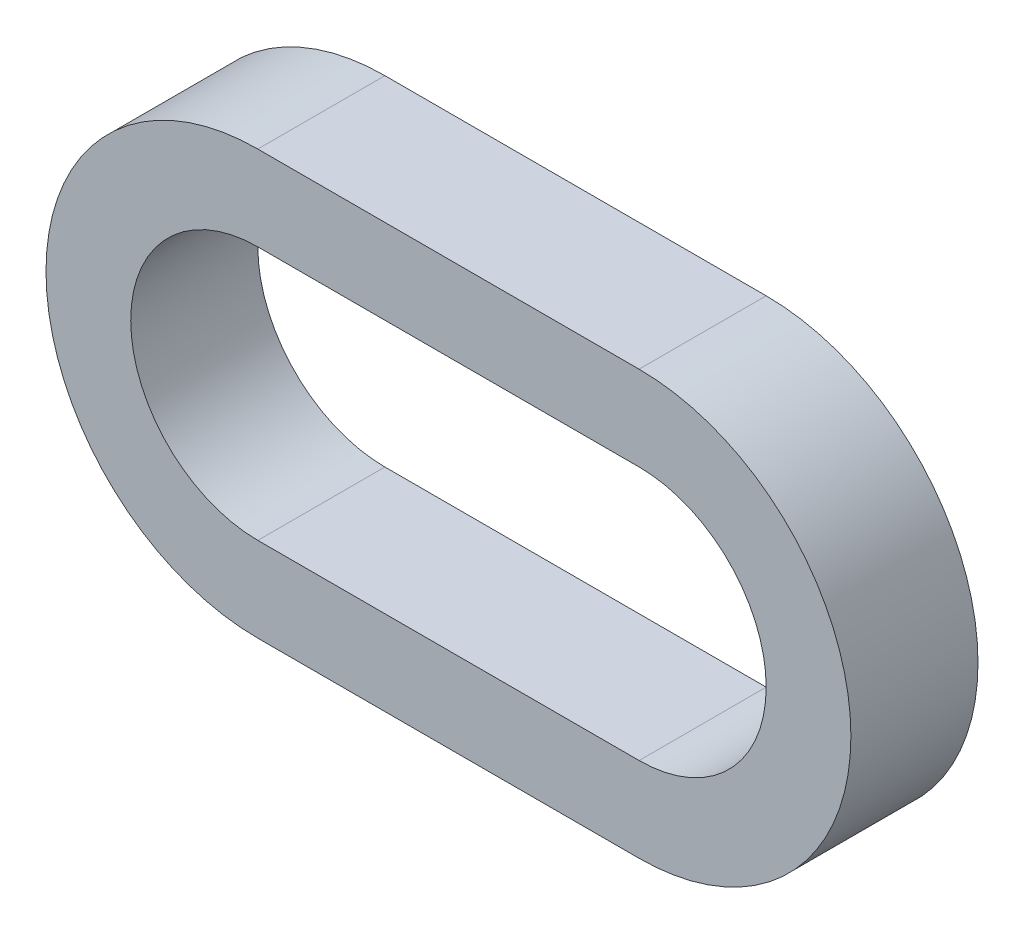
ISO-10303-21;
HEADER;
FILE_DESCRIPTION(('STEP AP214'),'2;1');
FILE_NAME('part.step','',(''),(''),'','','');
FILE_SCHEMA(('AUTOMOTIVE_DESIGN { 1 0 10303 214 1 1 1 1 }'));
ENDSEC;
DATA;
#1=APPLICATION_CONTEXT('core data for automotive mechanical design processes');
#2=APPLICATION_PROTOCOL_DEFINITION('international standard','automotive_design',2000,#1);
#3=PRODUCT_CONTEXT('',#1,'mechanical');
#4=PRODUCT('Part','Part','',(#3));
#5=PRODUCT_RELATED_PRODUCT_CATEGORY('part','',(#4));
#6=PRODUCT_DEFINITION_FORMATION('','',#4);
#7=PRODUCT_DEFINITION_CONTEXT('part definition',#1,'design');
#8=PRODUCT_DEFINITION('design','',#6,#7);
#9=PRODUCT_DEFINITION_SHAPE('','',#8);
#10=(LENGTH_UNIT() NAMED_UNIT(*) SI_UNIT(.MILLI.,.METRE.));
#11=(NAMED_UNIT(*) PLANE_ANGLE_UNIT() SI_UNIT($,.RADIAN.));
#12=(NAMED_UNIT(*) SI_UNIT($,.STERADIAN.) SOLID_ANGLE_UNIT());
#13=UNCERTAINTY_MEASURE_WITH_UNIT(LENGTH_MEASURE(1.E-05),#10,'distance_accuracy_value','');
#14=(GEOMETRIC_REPRESENTATION_CONTEXT(3) GLOBAL_UNCERTAINTY_ASSIGNED_CONTEXT((#13)) GLOBAL_UNIT_ASSIGNED_CONTEXT((#10,
#11,#12)) REPRESENTATION_CONTEXT('',''));
#15=CARTESIAN_POINT('',(0.,0.,0.));
#16=DIRECTION('',(0.,0.,1.));
#17=DIRECTION('',(1.,0.,0.));
#18=AXIS2_PLACEMENT_3D('',#15,#16,#17);
#19=CARTESIAN_POINT('',(-90.,0.,60.));
#20=DIRECTION('',(0.,0.,1.));
#21=DIRECTION('',(1.,0.,0.));
#22=AXIS2_PLACEMENT_3D('',#19,#20,#21);
#23=PLANE('',#22);
#24=CARTESIAN_POINT('',(-90.,0.,60.));
#25=DIRECTION('',(0.,0.,1.));
#26=DIRECTION('',(1.,0.,0.));
#27=AXIS2_PLACEMENT_3D('',#24,#25,#26);
#28=CIRCLE('',#27,100.);
#29=CARTESIAN_POINT('',(-90.,100.,60.));
#30=VERTEX_POINT('',#29);
#31=CARTESIAN_POINT('',(-90.,-100.,60.));
#32=VERTEX_POINT('',#31);
#33=EDGE_CURVE('E157',#30,#32,#28,.T.);
#34=ORIENTED_EDGE('',*,*,#33,.T.);
#35=DIRECTION('',(1.,0.,0.));
#36=VECTOR('',#35,1.);
#37=CARTESIAN_POINT('',(-90.,-100.,60.));
#38=LINE('',#37,#36);
#39=CARTESIAN_POINT('',(90.,-100.,60.));
#40=VERTEX_POINT('',#39);
#41=EDGE_CURVE('E161',#32,#40,#38,.T.);
#42=ORIENTED_EDGE('',*,*,#41,.T.);
#43=CARTESIAN_POINT('',(90.,0.,60.));
#44=DIRECTION('',(0.,0.,1.));
#45=DIRECTION('',(1.,0.,0.));
#46=AXIS2_PLACEMENT_3D('',#43,#44,#45);
#47=CIRCLE('',#46,100.);
#48=CARTESIAN_POINT('',(90.,100.,60.));
#49=VERTEX_POINT('',#48);
#50=EDGE_CURVE('E165',#40,#49,#47,.T.);
#51=ORIENTED_EDGE('',*,*,#50,.T.);
#52=DIRECTION('',(-1.,0.,0.));
#53=VECTOR('',#52,1.);
#54=CARTESIAN_POINT('',(-90.,100.,60.));
#55=LINE('',#54,#53);
#56=EDGE_CURVE('E168',#49,#30,#55,.T.);
#57=ORIENTED_EDGE('',*,*,#56,.T.);
#58=EDGE_LOOP('',(#34,#42,#51,#57));
#59=FACE_BOUND('',#58,.T.);
#60=DIRECTION('',(1.,0.,0.));
#61=VECTOR('',#60,1.);
#62=CARTESIAN_POINT('',(-90.,-60.,60.));
#63=LINE('',#62,#61);
#64=CARTESIAN_POINT('',(-90.,-60.,60.));
#65=VERTEX_POINT('',#64);
#66=CARTESIAN_POINT('',(90.,-60.,60.));
#67=VERTEX_POINT('',#66);
#68=EDGE_CURVE('E118',#65,#67,#63,.T.);
#69=ORIENTED_EDGE('',*,*,#68,.F.);
#70=CARTESIAN_POINT('',(-90.,0.,60.));
#71=DIRECTION('',(0.,0.,1.));
#72=DIRECTION('',(1.,0.,0.));
#73=AXIS2_PLACEMENT_3D('',#70,#71,#72);
#74=CIRCLE('',#73,60.);
#75=CARTESIAN_POINT('',(-90.,60.,60.));
#76=VERTEX_POINT('',#75);
#77=EDGE_CURVE('E109',#76,#65,#74,.T.);
#78=ORIENTED_EDGE('',*,*,#77,.F.);
#79=DIRECTION('',(-1.,0.,0.));
#80=VECTOR('',#79,1.);
#81=CARTESIAN_POINT('',(-90.,60.,60.));
#82=LINE('',#81,#80);
#83=CARTESIAN_POINT('',(90.,60.,60.));
#84=VERTEX_POINT('',#83);
#85=EDGE_CURVE('E135',#84,#76,#82,.T.);
#86=ORIENTED_EDGE('',*,*,#85,.F.);
#87=CARTESIAN_POINT('',(90.,0.,60.));
#88=DIRECTION('',(0.,0.,1.));
#89=DIRECTION('',(1.,0.,0.));
#90=AXIS2_PLACEMENT_3D('',#87,#88,#89);
#91=CIRCLE('',#90,60.);
#92=EDGE_CURVE('E131',#67,#84,#91,.T.);
#93=ORIENTED_EDGE('',*,*,#92,.F.);
#94=EDGE_LOOP('',(#69,#78,#86,#93));
#95=FACE_BOUND('',#94,.T.);
#96=ADVANCED_FACE('F43',(#59,#95),#23,.T.);
#97=CARTESIAN_POINT('',(-90.,0.,0.));
#98=DIRECTION('',(0.,0.,1.));
#99=DIRECTION('',(1.,0.,0.));
#100=AXIS2_PLACEMENT_3D('',#97,#98,#99);
#101=PLANE('',#100);
#102=CARTESIAN_POINT('',(-90.,0.,0.));
#103=DIRECTION('',(0.,0.,1.));
#104=DIRECTION('',(1.,0.,0.));
#105=AXIS2_PLACEMENT_3D('',#102,#103,#104);
#106=CIRCLE('',#105,100.);
#107=CARTESIAN_POINT('',(-90.,100.,0.));
#108=VERTEX_POINT('',#107);
#109=CARTESIAN_POINT('',(-90.,-100.,0.));
#110=VERTEX_POINT('',#109);
#111=EDGE_CURVE('E127',#108,#110,#106,.T.);
#112=ORIENTED_EDGE('',*,*,#111,.F.);
#113=DIRECTION('',(-1.,0.,0.));
#114=VECTOR('',#113,1.);
#115=CARTESIAN_POINT('',(-90.,100.,0.));
#116=LINE('',#115,#114);
#117=CARTESIAN_POINT('',(90.,100.,0.));
#118=VERTEX_POINT('',#117);
#119=EDGE_CURVE('E162',#118,#108,#116,.T.);
#120=ORIENTED_EDGE('',*,*,#119,.F.);
#121=CARTESIAN_POINT('',(90.,0.,0.));
#122=DIRECTION('',(0.,0.,1.));
#123=DIRECTION('',(1.,0.,0.));
#124=AXIS2_PLACEMENT_3D('',#121,#122,#123);
#125=CIRCLE('',#124,100.);
#126=CARTESIAN_POINT('',(90.,-100.,0.));
#127=VERTEX_POINT('',#126);
#128=EDGE_CURVE('E178',#127,#118,#125,.T.);
#129=ORIENTED_EDGE('',*,*,#128,.F.);
#130=DIRECTION('',(1.,0.,0.));
#131=VECTOR('',#130,1.);
#132=CARTESIAN_POINT('',(-90.,-100.,0.));
#133=LINE('',#132,#131);
#134=EDGE_CURVE('E175',#110,#127,#133,.T.);
#135=ORIENTED_EDGE('',*,*,#134,.F.);
#136=EDGE_LOOP('',(#112,#120,#129,#135));
#137=FACE_BOUND('',#136,.T.);
#138=CARTESIAN_POINT('',(-90.,0.,0.));
#139=DIRECTION('',(0.,0.,1.));
#140=DIRECTION('',(1.,0.,0.));
#141=AXIS2_PLACEMENT_3D('',#138,#139,#140);
#142=CIRCLE('',#141,60.);
#143=CARTESIAN_POINT('',(-90.,60.,0.));
#144=VERTEX_POINT('',#143);
#145=CARTESIAN_POINT('',(-90.,-60.,0.));
#146=VERTEX_POINT('',#145);
#147=EDGE_CURVE('E67',#144,#146,#142,.T.);
#148=ORIENTED_EDGE('',*,*,#147,.T.);
#149=DIRECTION('',(1.,0.,0.));
#150=VECTOR('',#149,1.);
#151=CARTESIAN_POINT('',(-90.,-60.,0.));
#152=LINE('',#151,#150);
#153=CARTESIAN_POINT('',(90.,-60.,0.));
#154=VERTEX_POINT('',#153);
#155=EDGE_CURVE('E125',#146,#154,#152,.T.);
#156=ORIENTED_EDGE('',*,*,#155,.T.);
#157=CARTESIAN_POINT('',(90.,0.,0.));
#158=DIRECTION('',(0.,0.,1.));
#159=DIRECTION('',(1.,0.,0.));
#160=AXIS2_PLACEMENT_3D('',#157,#158,#159);
#161=CIRCLE('',#160,60.);
#162=CARTESIAN_POINT('',(90.,60.,0.));
#163=VERTEX_POINT('',#162);
#164=EDGE_CURVE('E144',#154,#163,#161,.T.);
#165=ORIENTED_EDGE('',*,*,#164,.T.);
#166=DIRECTION('',(-1.,0.,0.));
#167=VECTOR('',#166,1.);
#168=CARTESIAN_POINT('',(-90.,60.,0.));
#169=LINE('',#168,#167);
#170=EDGE_CURVE('E119',#163,#144,#169,.T.);
#171=ORIENTED_EDGE('',*,*,#170,.T.);
#172=EDGE_LOOP('',(#148,#156,#165,#171));
#173=FACE_BOUND('',#172,.T.);
#174=ADVANCED_FACE('F201',(#137,#173),#101,.F.);
#175=CARTESIAN_POINT('',(-90.,0.,60.));
#176=DIRECTION('',(0.,0.,-1.));
#177=DIRECTION('',(-1.,0.,0.));
#178=AXIS2_PLACEMENT_3D('',#175,#176,#177);
#179=CYLINDRICAL_SURFACE('',#178,100.);
#180=ORIENTED_EDGE('',*,*,#111,.T.);
#181=DIRECTION('',(0.,0.,-1.));
#182=VECTOR('',#181,1.);
#183=CARTESIAN_POINT('',(-90.,-100.,60.));
#184=LINE('',#183,#182);
#185=EDGE_CURVE('E11',#32,#110,#184,.T.);
#186=ORIENTED_EDGE('',*,*,#185,.F.);
#187=ORIENTED_EDGE('',*,*,#33,.F.);
#188=DIRECTION('',(0.,0.,-1.));
#189=VECTOR('',#188,1.);
#190=CARTESIAN_POINT('',(-90.,100.,60.));
#191=LINE('',#190,#189);
#192=EDGE_CURVE('E171',#30,#108,#191,.T.);
#193=ORIENTED_EDGE('',*,*,#192,.T.);
#194=EDGE_LOOP('',(#180,#186,#187,#193));
#195=FACE_BOUND('',#194,.T.);
#196=ADVANCED_FACE('F45',(#195),#179,.T.);
#197=CARTESIAN_POINT('',(-90.,-100.,60.));
#198=DIRECTION('',(0.,1.,0.));
#199=DIRECTION('',(0.,0.,1.));
#200=AXIS2_PLACEMENT_3D('',#197,#198,#199);
#201=PLANE('',#200);
#202=ORIENTED_EDGE('',*,*,#134,.T.);
#203=DIRECTION('',(0.,0.,-1.));
#204=VECTOR('',#203,1.);
#205=CARTESIAN_POINT('',(90.,-100.,60.));
#206=LINE('',#205,#204);
#207=EDGE_CURVE('E52',#40,#127,#206,.T.);
#208=ORIENTED_EDGE('',*,*,#207,.F.);
#209=ORIENTED_EDGE('',*,*,#41,.F.);
#210=ORIENTED_EDGE('',*,*,#185,.T.);
#211=EDGE_LOOP('',(#202,#208,#209,#210));
#212=FACE_BOUND('',#211,.T.);
#213=ADVANCED_FACE('F211',(#212),#201,.F.);
#214=CARTESIAN_POINT('',(90.,0.,60.));
#215=DIRECTION('',(0.,0.,-1.));
#216=DIRECTION('',(-1.,0.,0.));
#217=AXIS2_PLACEMENT_3D('',#214,#215,#216);
#218=CYLINDRICAL_SURFACE('',#217,100.);
#219=ORIENTED_EDGE('',*,*,#128,.T.);
#220=DIRECTION('',(0.,0.,-1.));
#221=VECTOR('',#220,1.);
#222=CARTESIAN_POINT('',(90.,100.,60.));
#223=LINE('',#222,#221);
#224=EDGE_CURVE('E186',#49,#118,#223,.T.);
#225=ORIENTED_EDGE('',*,*,#224,.F.);
#226=ORIENTED_EDGE('',*,*,#50,.F.);
#227=ORIENTED_EDGE('',*,*,#207,.T.);
#228=EDGE_LOOP('',(#219,#225,#226,#227));
#229=FACE_BOUND('',#228,.T.);
#230=ADVANCED_FACE('F195',(#229),#218,.T.);
#231=CARTESIAN_POINT('',(-90.,100.,60.));
#232=DIRECTION('',(0.,-1.,0.));
#233=DIRECTION('',(0.,0.,-1.));
#234=AXIS2_PLACEMENT_3D('',#231,#232,#233);
#235=PLANE('',#234);
#236=ORIENTED_EDGE('',*,*,#119,.T.);
#237=ORIENTED_EDGE('',*,*,#192,.F.);
#238=ORIENTED_EDGE('',*,*,#56,.F.);
#239=ORIENTED_EDGE('',*,*,#224,.T.);
#240=EDGE_LOOP('',(#236,#237,#238,#239));
#241=FACE_BOUND('',#240,.T.);
#242=ADVANCED_FACE('F205',(#241),#235,.F.);
#243=CARTESIAN_POINT('',(-90.,0.,60.));
#244=DIRECTION('',(0.,0.,-1.));
#245=DIRECTION('',(-1.,0.,0.));
#246=AXIS2_PLACEMENT_3D('',#243,#244,#245);
#247=CYLINDRICAL_SURFACE('',#246,60.);
#248=ORIENTED_EDGE('',*,*,#147,.F.);
#249=DIRECTION('',(0.,0.,-1.));
#250=VECTOR('',#249,1.);
#251=CARTESIAN_POINT('',(-90.,60.,60.));
#252=LINE('',#251,#250);
#253=EDGE_CURVE('E113',#76,#144,#252,.T.);
#254=ORIENTED_EDGE('',*,*,#253,.F.);
#255=ORIENTED_EDGE('',*,*,#77,.T.);
#256=DIRECTION('',(0.,0.,-1.));
#257=VECTOR('',#256,1.);
#258=CARTESIAN_POINT('',(-90.,-60.,60.));
#259=LINE('',#258,#257);
#260=EDGE_CURVE('E112',#65,#146,#259,.T.);
#261=ORIENTED_EDGE('',*,*,#260,.T.);
#262=EDGE_LOOP('',(#248,#254,#255,#261));
#263=FACE_BOUND('',#262,.T.);
#264=ADVANCED_FACE('F111',(#263),#247,.F.);
#265=CARTESIAN_POINT('',(-90.,-60.,60.));
#266=DIRECTION('',(0.,1.,0.));
#267=DIRECTION('',(-1.,0.,0.));
#268=AXIS2_PLACEMENT_3D('',#265,#266,#267);
#269=PLANE('',#268);
#270=ORIENTED_EDGE('',*,*,#155,.F.);
#271=ORIENTED_EDGE('',*,*,#260,.F.);
#272=ORIENTED_EDGE('',*,*,#68,.T.);
#273=DIRECTION('',(0.,0.,-1.));
#274=VECTOR('',#273,1.);
#275=CARTESIAN_POINT('',(90.,-60.,60.));
#276=LINE('',#275,#274);
#277=EDGE_CURVE('E128',#67,#154,#276,.T.);
#278=ORIENTED_EDGE('',*,*,#277,.T.);
#279=EDGE_LOOP('',(#270,#271,#272,#278));
#280=FACE_BOUND('',#279,.T.);
#281=ADVANCED_FACE('F122',(#280),#269,.T.);
#282=CARTESIAN_POINT('',(90.,0.,60.));
#283=DIRECTION('',(0.,0.,-1.));
#284=DIRECTION('',(-1.,0.,0.));
#285=AXIS2_PLACEMENT_3D('',#282,#283,#284);
#286=CYLINDRICAL_SURFACE('',#285,60.);
#287=ORIENTED_EDGE('',*,*,#164,.F.);
#288=ORIENTED_EDGE('',*,*,#277,.F.);
#289=ORIENTED_EDGE('',*,*,#92,.T.);
#290=DIRECTION('',(0.,0.,-1.));
#291=VECTOR('',#290,1.);
#292=CARTESIAN_POINT('',(90.,60.,60.));
#293=LINE('',#292,#291);
#294=EDGE_CURVE('E59',#84,#163,#293,.T.);
#295=ORIENTED_EDGE('',*,*,#294,.T.);
#296=EDGE_LOOP('',(#287,#288,#289,#295));
#297=FACE_BOUND('',#296,.T.);
#298=ADVANCED_FACE('F234',(#297),#286,.F.);
#299=CARTESIAN_POINT('',(-90.,60.,60.));
#300=DIRECTION('',(0.,-1.,0.));
#301=DIRECTION('',(1.,0.,0.));
#302=AXIS2_PLACEMENT_3D('',#299,#300,#301);
#303=PLANE('',#302);
#304=ORIENTED_EDGE('',*,*,#170,.F.);
#305=ORIENTED_EDGE('',*,*,#294,.F.);
#306=ORIENTED_EDGE('',*,*,#85,.T.);
#307=ORIENTED_EDGE('',*,*,#253,.T.);
#308=EDGE_LOOP('',(#304,#305,#306,#307));
#309=FACE_BOUND('',#308,.T.);
#310=ADVANCED_FACE('F238',(#309),#303,.T.);
#311=CLOSED_SHELL('',(#96,#174,#196,#213,#230,#242,#264,#281,#298,#310));
#312=MANIFOLD_SOLID_BREP('B2',#311);
#313=ADVANCED_BREP_SHAPE_REPRESENTATION('',(#18,#312),#14);
#314=SHAPE_DEFINITION_REPRESENTATION(#9,#313);
ENDSEC;
END-ISO-10303-21;
